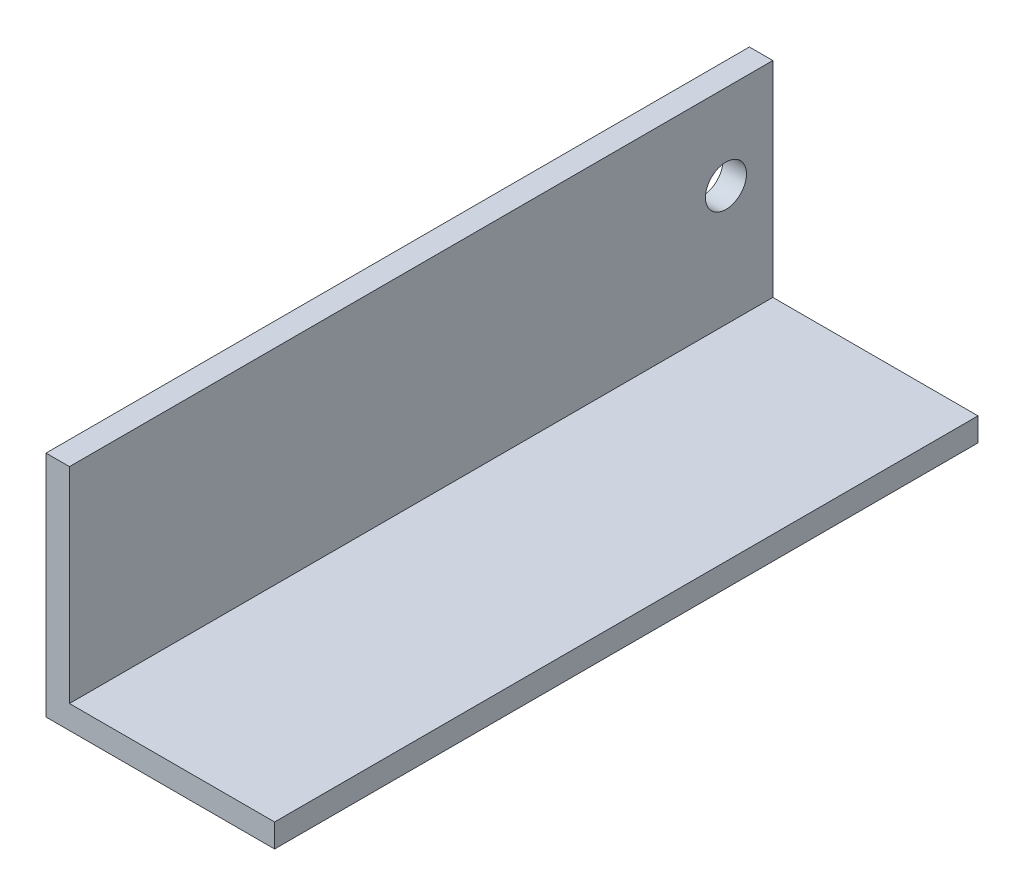
ISO-10303-21;
HEADER;
FILE_DESCRIPTION(('STEP AP214'),'2;1');
FILE_NAME('part.step','',(''),(''),'','','');
FILE_SCHEMA(('AUTOMOTIVE_DESIGN { 1 0 10303 214 1 1 1 1 }'));
ENDSEC;
DATA;
#1=APPLICATION_CONTEXT('core data for automotive mechanical design processes');
#2=APPLICATION_PROTOCOL_DEFINITION('international standard','automotive_design',2000,#1);
#3=PRODUCT_CONTEXT('',#1,'mechanical');
#4=PRODUCT('Part','Part','',(#3));
#5=PRODUCT_RELATED_PRODUCT_CATEGORY('part','',(#4));
#6=PRODUCT_DEFINITION_FORMATION('','',#4);
#7=PRODUCT_DEFINITION_CONTEXT('part definition',#1,'design');
#8=PRODUCT_DEFINITION('design','',#6,#7);
#9=PRODUCT_DEFINITION_SHAPE('','',#8);
#10=(LENGTH_UNIT() NAMED_UNIT(*) SI_UNIT(.MILLI.,.METRE.));
#11=(NAMED_UNIT(*) PLANE_ANGLE_UNIT() SI_UNIT($,.RADIAN.));
#12=(NAMED_UNIT(*) SI_UNIT($,.STERADIAN.) SOLID_ANGLE_UNIT());
#13=UNCERTAINTY_MEASURE_WITH_UNIT(LENGTH_MEASURE(1.E-05),#10,'distance_accuracy_value','');
#14=(GEOMETRIC_REPRESENTATION_CONTEXT(3) GLOBAL_UNCERTAINTY_ASSIGNED_CONTEXT((#13)) GLOBAL_UNIT_ASSIGNED_CONTEXT((#10,
#11,#12)) REPRESENTATION_CONTEXT('',''));
#15=CARTESIAN_POINT('',(0.,0.,0.));
#16=DIRECTION('',(0.,0.,1.));
#17=DIRECTION('',(1.,0.,0.));
#18=AXIS2_PLACEMENT_3D('',#15,#16,#17);
#19=CARTESIAN_POINT('',(19.5,0.,60.));
#20=DIRECTION('',(0.,1.,0.));
#21=DIRECTION('',(-1.,0.,0.));
#22=AXIS2_PLACEMENT_3D('',#19,#20,#21);
#23=PLANE('',#22);
#24=DIRECTION('',(1.,0.,0.));
#25=VECTOR('',#24,1.);
#26=CARTESIAN_POINT('',(19.5,0.,0.));
#27=LINE('',#26,#25);
#28=CARTESIAN_POINT('',(0.,0.,0.));
#29=VERTEX_POINT('',#28);
#30=CARTESIAN_POINT('',(19.5,0.,0.));
#31=VERTEX_POINT('',#30);
#32=EDGE_CURVE('E117',#29,#31,#27,.T.);
#33=ORIENTED_EDGE('',*,*,#32,.T.);
#34=DIRECTION('',(0.,0.,-1.));
#35=VECTOR('',#34,1.);
#36=CARTESIAN_POINT('',(19.5,0.,60.));
#37=LINE('',#36,#35);
#38=CARTESIAN_POINT('',(19.5,0.,60.));
#39=VERTEX_POINT('',#38);
#40=EDGE_CURVE('E11',#39,#31,#37,.T.);
#41=ORIENTED_EDGE('',*,*,#40,.F.);
#42=DIRECTION('',(1.,0.,0.));
#43=VECTOR('',#42,1.);
#44=CARTESIAN_POINT('',(19.5,0.,60.));
#45=LINE('',#44,#43);
#46=CARTESIAN_POINT('',(0.,0.,60.));
#47=VERTEX_POINT('',#46);
#48=EDGE_CURVE('E128',#47,#39,#45,.T.);
#49=ORIENTED_EDGE('',*,*,#48,.F.);
#50=DIRECTION('',(0.,0.,-1.));
#51=VECTOR('',#50,1.);
#52=CARTESIAN_POINT('',(0.,0.,60.));
#53=LINE('',#52,#51);
#54=EDGE_CURVE('E113',#47,#29,#53,.T.);
#55=ORIENTED_EDGE('',*,*,#54,.T.);
#56=EDGE_LOOP('',(#33,#41,#49,#55));
#57=FACE_BOUND('',#56,.T.);
#58=ADVANCED_FACE('F33',(#57),#23,.F.);
#59=CARTESIAN_POINT('',(19.5,2.,60.));
#60=DIRECTION('',(-1.,0.,0.));
#61=DIRECTION('',(0.,0.,1.));
#62=AXIS2_PLACEMENT_3D('',#59,#60,#61);
#63=PLANE('',#62);
#64=DIRECTION('',(0.,1.,0.));
#65=VECTOR('',#64,1.);
#66=CARTESIAN_POINT('',(19.5,2.,0.));
#67=LINE('',#66,#65);
#68=CARTESIAN_POINT('',(19.5,2.,0.));
#69=VERTEX_POINT('',#68);
#70=EDGE_CURVE('E120',#31,#69,#67,.T.);
#71=ORIENTED_EDGE('',*,*,#70,.T.);
#72=DIRECTION('',(0.,0.,-1.));
#73=VECTOR('',#72,1.);
#74=CARTESIAN_POINT('',(19.5,2.,60.));
#75=LINE('',#74,#73);
#76=CARTESIAN_POINT('',(19.5,2.,60.));
#77=VERTEX_POINT('',#76);
#78=EDGE_CURVE('E41',#77,#69,#75,.T.);
#79=ORIENTED_EDGE('',*,*,#78,.F.);
#80=DIRECTION('',(0.,1.,0.));
#81=VECTOR('',#80,1.);
#82=CARTESIAN_POINT('',(19.5,2.,60.));
#83=LINE('',#82,#81);
#84=EDGE_CURVE('E86',#39,#77,#83,.T.);
#85=ORIENTED_EDGE('',*,*,#84,.F.);
#86=ORIENTED_EDGE('',*,*,#40,.T.);
#87=EDGE_LOOP('',(#71,#79,#85,#86));
#88=FACE_BOUND('',#87,.T.);
#89=ADVANCED_FACE('F154',(#88),#63,.F.);
#90=CARTESIAN_POINT('',(2.,2.,60.));
#91=DIRECTION('',(0.,-1.,0.));
#92=DIRECTION('',(0.,0.,-1.));
#93=AXIS2_PLACEMENT_3D('',#90,#91,#92);
#94=PLANE('',#93);
#95=DIRECTION('',(-1.,0.,0.));
#96=VECTOR('',#95,1.);
#97=CARTESIAN_POINT('',(2.,2.,0.));
#98=LINE('',#97,#96);
#99=CARTESIAN_POINT('',(2.,2.,0.));
#100=VERTEX_POINT('',#99);
#101=EDGE_CURVE('E123',#69,#100,#98,.T.);
#102=ORIENTED_EDGE('',*,*,#101,.T.);
#103=DIRECTION('',(0.,0.,-1.));
#104=VECTOR('',#103,1.);
#105=CARTESIAN_POINT('',(2.,2.,60.));
#106=LINE('',#105,#104);
#107=CARTESIAN_POINT('',(2.,2.,60.));
#108=VERTEX_POINT('',#107);
#109=EDGE_CURVE('E108',#108,#100,#106,.T.);
#110=ORIENTED_EDGE('',*,*,#109,.F.);
#111=DIRECTION('',(-1.,0.,0.));
#112=VECTOR('',#111,1.);
#113=CARTESIAN_POINT('',(2.,2.,60.));
#114=LINE('',#113,#112);
#115=EDGE_CURVE('E99',#77,#108,#114,.T.);
#116=ORIENTED_EDGE('',*,*,#115,.F.);
#117=ORIENTED_EDGE('',*,*,#78,.T.);
#118=EDGE_LOOP('',(#102,#110,#116,#117));
#119=FACE_BOUND('',#118,.T.);
#120=ADVANCED_FACE('F134',(#119),#94,.F.);
#121=CARTESIAN_POINT('',(2.,19.5,60.));
#122=DIRECTION('',(-1.,0.,0.));
#123=DIRECTION('',(0.,-1.,0.));
#124=AXIS2_PLACEMENT_3D('',#121,#122,#123);
#125=PLANE('',#124);
#126=CARTESIAN_POINT('',(2.,12.25,4.));
#127=DIRECTION('',(1.,0.,0.));
#128=DIRECTION('',(0.,1.,0.));
#129=AXIS2_PLACEMENT_3D('',#126,#127,#128);
#130=CIRCLE('',#129,1.75);
#131=CARTESIAN_POINT('',(2.,14.,4.));
#132=VERTEX_POINT('',#131);
#133=EDGE_CURVE('E169',#132,#132,#130,.T.);
#134=ORIENTED_EDGE('',*,*,#133,.F.);
#135=EDGE_LOOP('',(#134));
#136=FACE_BOUND('',#135,.T.);
#137=DIRECTION('',(0.,1.,0.));
#138=VECTOR('',#137,1.);
#139=CARTESIAN_POINT('',(2.,19.5,0.));
#140=LINE('',#139,#138);
#141=CARTESIAN_POINT('',(2.,19.5,0.));
#142=VERTEX_POINT('',#141);
#143=EDGE_CURVE('E107',#100,#142,#140,.T.);
#144=ORIENTED_EDGE('',*,*,#143,.T.);
#145=DIRECTION('',(0.,0.,-1.));
#146=VECTOR('',#145,1.);
#147=CARTESIAN_POINT('',(2.,19.5,60.));
#148=LINE('',#147,#146);
#149=CARTESIAN_POINT('',(2.,19.5,60.));
#150=VERTEX_POINT('',#149);
#151=EDGE_CURVE('E104',#150,#142,#148,.T.);
#152=ORIENTED_EDGE('',*,*,#151,.F.);
#153=DIRECTION('',(0.,1.,0.));
#154=VECTOR('',#153,1.);
#155=CARTESIAN_POINT('',(2.,19.5,60.));
#156=LINE('',#155,#154);
#157=EDGE_CURVE('E93',#108,#150,#156,.T.);
#158=ORIENTED_EDGE('',*,*,#157,.F.);
#159=ORIENTED_EDGE('',*,*,#109,.T.);
#160=EDGE_LOOP('',(#144,#152,#158,#159));
#161=FACE_BOUND('',#160,.T.);
#162=ADVANCED_FACE('F105',(#136,#161),#125,.F.);
#163=CARTESIAN_POINT('',(0.,19.5,60.));
#164=DIRECTION('',(0.,-1.,0.));
#165=DIRECTION('',(0.,0.,-1.));
#166=AXIS2_PLACEMENT_3D('',#163,#164,#165);
#167=PLANE('',#166);
#168=DIRECTION('',(-1.,0.,0.));
#169=VECTOR('',#168,1.);
#170=CARTESIAN_POINT('',(0.,19.5,0.));
#171=LINE('',#170,#169);
#172=CARTESIAN_POINT('',(0.,19.5,0.));
#173=VERTEX_POINT('',#172);
#174=EDGE_CURVE('E72',#142,#173,#171,.T.);
#175=ORIENTED_EDGE('',*,*,#174,.T.);
#176=DIRECTION('',(0.,0.,-1.));
#177=VECTOR('',#176,1.);
#178=CARTESIAN_POINT('',(0.,19.5,60.));
#179=LINE('',#178,#177);
#180=CARTESIAN_POINT('',(0.,19.5,60.));
#181=VERTEX_POINT('',#180);
#182=EDGE_CURVE('E109',#181,#173,#179,.T.);
#183=ORIENTED_EDGE('',*,*,#182,.F.);
#184=DIRECTION('',(-1.,0.,0.));
#185=VECTOR('',#184,1.);
#186=CARTESIAN_POINT('',(0.,19.5,60.));
#187=LINE('',#186,#185);
#188=EDGE_CURVE('E97',#150,#181,#187,.T.);
#189=ORIENTED_EDGE('',*,*,#188,.F.);
#190=ORIENTED_EDGE('',*,*,#151,.T.);
#191=EDGE_LOOP('',(#175,#183,#189,#190));
#192=FACE_BOUND('',#191,.T.);
#193=ADVANCED_FACE('F111',(#192),#167,.F.);
#194=CARTESIAN_POINT('',(0.,0.,60.));
#195=DIRECTION('',(1.,0.,0.));
#196=DIRECTION('',(0.,0.,-1.));
#197=AXIS2_PLACEMENT_3D('',#194,#195,#196);
#198=PLANE('',#197);
#199=CARTESIAN_POINT('',(0.,12.25,4.));
#200=DIRECTION('',(1.,0.,0.));
#201=DIRECTION('',(0.,1.,0.));
#202=AXIS2_PLACEMENT_3D('',#199,#200,#201);
#203=CIRCLE('',#202,1.75);
#204=CARTESIAN_POINT('',(0.,14.,4.));
#205=VERTEX_POINT('',#204);
#206=EDGE_CURVE('E121',#205,#205,#203,.T.);
#207=ORIENTED_EDGE('',*,*,#206,.T.);
#208=EDGE_LOOP('',(#207));
#209=FACE_BOUND('',#208,.T.);
#210=DIRECTION('',(0.,-1.,0.));
#211=VECTOR('',#210,1.);
#212=CARTESIAN_POINT('',(0.,0.,0.));
#213=LINE('',#212,#211);
#214=EDGE_CURVE('E78',#173,#29,#213,.T.);
#215=ORIENTED_EDGE('',*,*,#214,.T.);
#216=ORIENTED_EDGE('',*,*,#54,.F.);
#217=DIRECTION('',(0.,-1.,0.));
#218=VECTOR('',#217,1.);
#219=CARTESIAN_POINT('',(0.,0.,60.));
#220=LINE('',#219,#218);
#221=EDGE_CURVE('E49',#181,#47,#220,.T.);
#222=ORIENTED_EDGE('',*,*,#221,.F.);
#223=ORIENTED_EDGE('',*,*,#182,.T.);
#224=EDGE_LOOP('',(#215,#216,#222,#223));
#225=FACE_BOUND('',#224,.T.);
#226=ADVANCED_FACE('F141',(#209,#225),#198,.F.);
#227=CARTESIAN_POINT('',(0.,0.,60.));
#228=DIRECTION('',(0.,0.,-1.));
#229=DIRECTION('',(-1.,0.,0.));
#230=AXIS2_PLACEMENT_3D('',#227,#228,#229);
#231=PLANE('',#230);
#232=ORIENTED_EDGE('',*,*,#48,.T.);
#233=ORIENTED_EDGE('',*,*,#84,.T.);
#234=ORIENTED_EDGE('',*,*,#115,.T.);
#235=ORIENTED_EDGE('',*,*,#157,.T.);
#236=ORIENTED_EDGE('',*,*,#188,.T.);
#237=ORIENTED_EDGE('',*,*,#221,.T.);
#238=EDGE_LOOP('',(#232,#233,#234,#235,#236,#237));
#239=FACE_BOUND('',#238,.T.);
#240=ADVANCED_FACE('F95',(#239),#231,.F.);
#241=CARTESIAN_POINT('',(0.,0.,0.));
#242=DIRECTION('',(0.,0.,-1.));
#243=DIRECTION('',(-1.,0.,0.));
#244=AXIS2_PLACEMENT_3D('',#241,#242,#243);
#245=PLANE('',#244);
#246=ORIENTED_EDGE('',*,*,#32,.F.);
#247=ORIENTED_EDGE('',*,*,#214,.F.);
#248=ORIENTED_EDGE('',*,*,#174,.F.);
#249=ORIENTED_EDGE('',*,*,#143,.F.);
#250=ORIENTED_EDGE('',*,*,#101,.F.);
#251=ORIENTED_EDGE('',*,*,#70,.F.);
#252=EDGE_LOOP('',(#246,#247,#248,#249,#250,#251));
#253=FACE_BOUND('',#252,.T.);
#254=ADVANCED_FACE('F137',(#253),#245,.T.);
#255=CARTESIAN_POINT('',(0.,12.25,4.));
#256=DIRECTION('',(1.,0.,0.));
#257=DIRECTION('',(0.,1.,0.));
#258=AXIS2_PLACEMENT_3D('',#255,#256,#257);
#259=CYLINDRICAL_SURFACE('',#258,1.75);
#260=ORIENTED_EDGE('',*,*,#206,.F.);
#261=EDGE_LOOP('',(#260));
#262=FACE_BOUND('',#261,.T.);
#263=ORIENTED_EDGE('',*,*,#133,.T.);
#264=EDGE_LOOP('',(#263));
#265=FACE_BOUND('',#264,.T.);
#266=ADVANCED_FACE('F177',(#262,#265),#259,.F.);
#267=CLOSED_SHELL('',(#58,#89,#120,#162,#193,#226,#240,#254,#266));
#268=MANIFOLD_SOLID_BREP('B2',#267);
#269=ADVANCED_BREP_SHAPE_REPRESENTATION('',(#18,#268),#14);
#270=SHAPE_DEFINITION_REPRESENTATION(#9,#269);
ENDSEC;
END-ISO-10303-21;
